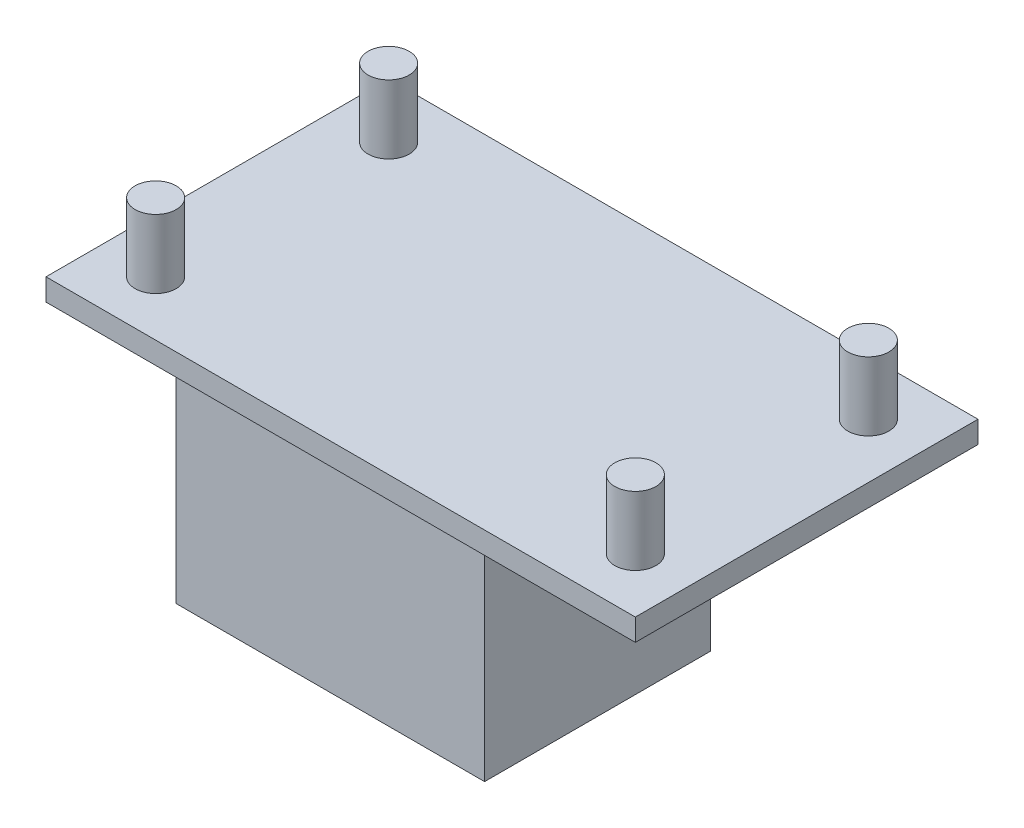
ISO-10303-21;
HEADER;
FILE_DESCRIPTION(('STEP AP214'),'2;1');
FILE_NAME('part.step','',(''),(''),'','','');
FILE_SCHEMA(('AUTOMOTIVE_DESIGN { 1 0 10303 214 1 1 1 1 }'));
ENDSEC;
DATA;
#1=APPLICATION_CONTEXT('core data for automotive mechanical design processes');
#2=APPLICATION_PROTOCOL_DEFINITION('international standard','automotive_design',2000,#1);
#3=PRODUCT_CONTEXT('',#1,'mechanical');
#4=PRODUCT('Part','Part','',(#3));
#5=PRODUCT_RELATED_PRODUCT_CATEGORY('part','',(#4));
#6=PRODUCT_DEFINITION_FORMATION('','',#4);
#7=PRODUCT_DEFINITION_CONTEXT('part definition',#1,'design');
#8=PRODUCT_DEFINITION('design','',#6,#7);
#9=PRODUCT_DEFINITION_SHAPE('','',#8);
#10=(LENGTH_UNIT() NAMED_UNIT(*) SI_UNIT(.MILLI.,.METRE.));
#11=(NAMED_UNIT(*) PLANE_ANGLE_UNIT() SI_UNIT($,.RADIAN.));
#12=(NAMED_UNIT(*) SI_UNIT($,.STERADIAN.) SOLID_ANGLE_UNIT());
#13=UNCERTAINTY_MEASURE_WITH_UNIT(LENGTH_MEASURE(1.E-05),#10,'distance_accuracy_value','');
#14=(GEOMETRIC_REPRESENTATION_CONTEXT(3) GLOBAL_UNCERTAINTY_ASSIGNED_CONTEXT((#13)) GLOBAL_UNIT_ASSIGNED_CONTEXT((#10,
#11,#12)) REPRESENTATION_CONTEXT('',''));
#15=CARTESIAN_POINT('',(0.,0.,0.));
#16=DIRECTION('',(0.,0.,1.));
#17=DIRECTION('',(1.,0.,0.));
#18=AXIS2_PLACEMENT_3D('',#15,#16,#17);
#19=CARTESIAN_POINT('',(-17.5,25.4,-8.5));
#20=DIRECTION('',(0.,-1.,0.));
#21=DIRECTION('',(0.,0.,-1.));
#22=AXIS2_PLACEMENT_3D('',#19,#20,#21);
#23=CYLINDRICAL_SURFACE('',#22,1.5);
#24=CARTESIAN_POINT('',(-17.5,25.4,-8.5));
#25=DIRECTION('',(0.,1.,0.));
#26=DIRECTION('',(0.,0.,1.));
#27=AXIS2_PLACEMENT_3D('',#24,#25,#26);
#28=CIRCLE('',#27,1.5);
#29=CARTESIAN_POINT('',(-17.5,25.4,-7.));
#30=VERTEX_POINT('',#29);
#31=EDGE_CURVE('E11',#30,#30,#28,.T.);
#32=ORIENTED_EDGE('',*,*,#31,.F.);
#33=EDGE_LOOP('',(#32));
#34=FACE_BOUND('',#33,.T.);
#35=CARTESIAN_POINT('',(-17.5,20.4,-8.5));
#36=DIRECTION('',(0.,1.,0.));
#37=DIRECTION('',(0.,0.,1.));
#38=AXIS2_PLACEMENT_3D('',#35,#36,#37);
#39=CIRCLE('',#38,1.5);
#40=CARTESIAN_POINT('',(-17.5,20.4,-7.));
#41=VERTEX_POINT('',#40);
#42=EDGE_CURVE('E46',#41,#41,#39,.T.);
#43=ORIENTED_EDGE('',*,*,#42,.T.);
#44=EDGE_LOOP('',(#43));
#45=FACE_BOUND('',#44,.T.);
#46=ADVANCED_FACE('F43',(#34,#45),#23,.T.);
#47=CARTESIAN_POINT('',(-17.5,25.4,-8.5));
#48=DIRECTION('',(0.,1.,0.));
#49=DIRECTION('',(0.,0.,1.));
#50=AXIS2_PLACEMENT_3D('',#47,#48,#49);
#51=PLANE('',#50);
#52=ORIENTED_EDGE('',*,*,#31,.T.);
#53=EDGE_LOOP('',(#52));
#54=FACE_BOUND('',#53,.T.);
#55=ADVANCED_FACE('F221',(#54),#51,.T.);
#56=CARTESIAN_POINT('',(-21.5,20.4,-12.5));
#57=DIRECTION('',(1.,0.,0.));
#58=DIRECTION('',(0.,0.,-1.));
#59=AXIS2_PLACEMENT_3D('',#56,#57,#58);
#60=PLANE('',#59);
#61=DIRECTION('',(0.,0.,1.));
#62=VECTOR('',#61,1.);
#63=CARTESIAN_POINT('',(-21.5,18.8,-12.5));
#64=LINE('',#63,#62);
#65=CARTESIAN_POINT('',(-21.5,18.8,-12.5));
#66=VERTEX_POINT('',#65);
#67=CARTESIAN_POINT('',(-21.5,18.8,12.5));
#68=VERTEX_POINT('',#67);
#69=EDGE_CURVE('E175',#66,#68,#64,.T.);
#70=ORIENTED_EDGE('',*,*,#69,.T.);
#71=DIRECTION('',(0.,-1.,0.));
#72=VECTOR('',#71,1.);
#73=CARTESIAN_POINT('',(-21.5,20.4,12.5));
#74=LINE('',#73,#72);
#75=CARTESIAN_POINT('',(-21.5,20.4,12.5));
#76=VERTEX_POINT('',#75);
#77=EDGE_CURVE('E193',#76,#68,#74,.T.);
#78=ORIENTED_EDGE('',*,*,#77,.F.);
#79=DIRECTION('',(0.,0.,1.));
#80=VECTOR('',#79,1.);
#81=CARTESIAN_POINT('',(-21.5,20.4,-12.5));
#82=LINE('',#81,#80);
#83=CARTESIAN_POINT('',(-21.5,20.4,-12.5));
#84=VERTEX_POINT('',#83);
#85=EDGE_CURVE('E174',#84,#76,#82,.T.);
#86=ORIENTED_EDGE('',*,*,#85,.F.);
#87=DIRECTION('',(0.,-1.,0.));
#88=VECTOR('',#87,1.);
#89=CARTESIAN_POINT('',(-21.5,20.4,-12.5));
#90=LINE('',#89,#88);
#91=EDGE_CURVE('E182',#84,#66,#90,.T.);
#92=ORIENTED_EDGE('',*,*,#91,.T.);
#93=EDGE_LOOP('',(#70,#78,#86,#92));
#94=FACE_BOUND('',#93,.T.);
#95=ADVANCED_FACE('F208',(#94),#60,.F.);
#96=CARTESIAN_POINT('',(-21.5,20.4,12.5));
#97=DIRECTION('',(0.,0.,-1.));
#98=DIRECTION('',(-1.,0.,0.));
#99=AXIS2_PLACEMENT_3D('',#96,#97,#98);
#100=PLANE('',#99);
#101=DIRECTION('',(1.,0.,0.));
#102=VECTOR('',#101,1.);
#103=CARTESIAN_POINT('',(-21.5,18.8,12.5));
#104=LINE('',#103,#102);
#105=CARTESIAN_POINT('',(21.5,18.8,12.5));
#106=VERTEX_POINT('',#105);
#107=EDGE_CURVE('E184',#68,#106,#104,.T.);
#108=ORIENTED_EDGE('',*,*,#107,.T.);
#109=DIRECTION('',(0.,-1.,0.));
#110=VECTOR('',#109,1.);
#111=CARTESIAN_POINT('',(21.5,20.4,12.5));
#112=LINE('',#111,#110);
#113=CARTESIAN_POINT('',(21.5,20.4,12.5));
#114=VERTEX_POINT('',#113);
#115=EDGE_CURVE('E195',#114,#106,#112,.T.);
#116=ORIENTED_EDGE('',*,*,#115,.F.);
#117=DIRECTION('',(1.,0.,0.));
#118=VECTOR('',#117,1.);
#119=CARTESIAN_POINT('',(-21.5,20.4,12.5));
#120=LINE('',#119,#118);
#121=EDGE_CURVE('E92',#76,#114,#120,.T.);
#122=ORIENTED_EDGE('',*,*,#121,.F.);
#123=ORIENTED_EDGE('',*,*,#77,.T.);
#124=EDGE_LOOP('',(#108,#116,#122,#123));
#125=FACE_BOUND('',#124,.T.);
#126=ADVANCED_FACE('F211',(#125),#100,.F.);
#127=CARTESIAN_POINT('',(21.5,20.4,12.5));
#128=DIRECTION('',(-1.,0.,0.));
#129=DIRECTION('',(0.,0.,1.));
#130=AXIS2_PLACEMENT_3D('',#127,#128,#129);
#131=PLANE('',#130);
#132=DIRECTION('',(0.,0.,-1.));
#133=VECTOR('',#132,1.);
#134=CARTESIAN_POINT('',(21.5,18.8,12.5));
#135=LINE('',#134,#133);
#136=CARTESIAN_POINT('',(21.5,18.8,-12.5));
#137=VERTEX_POINT('',#136);
#138=EDGE_CURVE('E186',#106,#137,#135,.T.);
#139=ORIENTED_EDGE('',*,*,#138,.T.);
#140=DIRECTION('',(0.,-1.,0.));
#141=VECTOR('',#140,1.);
#142=CARTESIAN_POINT('',(21.5,20.4,-12.5));
#143=LINE('',#142,#141);
#144=CARTESIAN_POINT('',(21.5,20.4,-12.5));
#145=VERTEX_POINT('',#144);
#146=EDGE_CURVE('E189',#145,#137,#143,.T.);
#147=ORIENTED_EDGE('',*,*,#146,.F.);
#148=DIRECTION('',(0.,0.,-1.));
#149=VECTOR('',#148,1.);
#150=CARTESIAN_POINT('',(21.5,20.4,12.5));
#151=LINE('',#150,#149);
#152=EDGE_CURVE('E179',#114,#145,#151,.T.);
#153=ORIENTED_EDGE('',*,*,#152,.F.);
#154=ORIENTED_EDGE('',*,*,#115,.T.);
#155=EDGE_LOOP('',(#139,#147,#153,#154));
#156=FACE_BOUND('',#155,.T.);
#157=ADVANCED_FACE('F212',(#156),#131,.F.);
#158=CARTESIAN_POINT('',(21.5,20.4,-12.5));
#159=DIRECTION('',(0.,0.,1.));
#160=DIRECTION('',(1.,0.,0.));
#161=AXIS2_PLACEMENT_3D('',#158,#159,#160);
#162=PLANE('',#161);
#163=DIRECTION('',(-1.,0.,0.));
#164=VECTOR('',#163,1.);
#165=CARTESIAN_POINT('',(21.5,18.8,-12.5));
#166=LINE('',#165,#164);
#167=EDGE_CURVE('E87',#137,#66,#166,.T.);
#168=ORIENTED_EDGE('',*,*,#167,.T.);
#169=ORIENTED_EDGE('',*,*,#91,.F.);
#170=DIRECTION('',(-1.,0.,0.));
#171=VECTOR('',#170,1.);
#172=CARTESIAN_POINT('',(21.5,20.4,-12.5));
#173=LINE('',#172,#171);
#174=EDGE_CURVE('E67',#145,#84,#173,.T.);
#175=ORIENTED_EDGE('',*,*,#174,.F.);
#176=ORIENTED_EDGE('',*,*,#146,.T.);
#177=EDGE_LOOP('',(#168,#169,#175,#176));
#178=FACE_BOUND('',#177,.T.);
#179=ADVANCED_FACE('F201',(#178),#162,.F.);
#180=CARTESIAN_POINT('',(0.,20.4,0.));
#181=DIRECTION('',(0.,1.,0.));
#182=DIRECTION('',(0.,0.,1.));
#183=AXIS2_PLACEMENT_3D('',#180,#181,#182);
#184=PLANE('',#183);
#185=CARTESIAN_POINT('',(17.5,20.4,8.5));
#186=DIRECTION('',(0.,1.,0.));
#187=DIRECTION('',(0.,0.,1.));
#188=AXIS2_PLACEMENT_3D('',#185,#186,#187);
#189=CIRCLE('',#188,1.5);
#190=CARTESIAN_POINT('',(17.5,20.4,10.));
#191=VERTEX_POINT('',#190);
#192=EDGE_CURVE('E132',#191,#191,#189,.T.);
#193=ORIENTED_EDGE('',*,*,#192,.F.);
#194=EDGE_LOOP('',(#193));
#195=FACE_BOUND('',#194,.T.);
#196=CARTESIAN_POINT('',(17.5,20.4,-8.5));
#197=DIRECTION('',(0.,1.,0.));
#198=DIRECTION('',(0.,0.,1.));
#199=AXIS2_PLACEMENT_3D('',#196,#197,#198);
#200=CIRCLE('',#199,1.5);
#201=CARTESIAN_POINT('',(17.5,20.4,-7.));
#202=VERTEX_POINT('',#201);
#203=EDGE_CURVE('E159',#202,#202,#200,.T.);
#204=ORIENTED_EDGE('',*,*,#203,.F.);
#205=EDGE_LOOP('',(#204));
#206=FACE_BOUND('',#205,.T.);
#207=CARTESIAN_POINT('',(-17.5,20.4,8.5));
#208=DIRECTION('',(0.,1.,0.));
#209=DIRECTION('',(0.,0.,1.));
#210=AXIS2_PLACEMENT_3D('',#207,#208,#209);
#211=CIRCLE('',#210,1.5);
#212=CARTESIAN_POINT('',(-17.5,20.4,10.));
#213=VERTEX_POINT('',#212);
#214=EDGE_CURVE('E167',#213,#213,#211,.T.);
#215=ORIENTED_EDGE('',*,*,#214,.F.);
#216=EDGE_LOOP('',(#215));
#217=FACE_BOUND('',#216,.T.);
#218=ORIENTED_EDGE('',*,*,#42,.F.);
#219=EDGE_LOOP('',(#218));
#220=FACE_BOUND('',#219,.T.);
#221=ORIENTED_EDGE('',*,*,#85,.T.);
#222=ORIENTED_EDGE('',*,*,#121,.T.);
#223=ORIENTED_EDGE('',*,*,#152,.T.);
#224=ORIENTED_EDGE('',*,*,#174,.T.);
#225=EDGE_LOOP('',(#221,#222,#223,#224));
#226=FACE_BOUND('',#225,.T.);
#227=ADVANCED_FACE('F203',(#195,#206,#217,#220,#226),#184,.T.);
#228=CARTESIAN_POINT('',(0.,18.8,0.));
#229=DIRECTION('',(0.,1.,0.));
#230=DIRECTION('',(0.,0.,1.));
#231=AXIS2_PLACEMENT_3D('',#228,#229,#230);
#232=PLANE('',#231);
#233=DIRECTION('',(-1.,0.,0.));
#234=VECTOR('',#233,1.);
#235=CARTESIAN_POINT('',(6.,18.8,-8.5));
#236=LINE('',#235,#234);
#237=CARTESIAN_POINT('',(6.,18.8,-8.5));
#238=VERTEX_POINT('',#237);
#239=CARTESIAN_POINT('',(-16.5,18.8,-8.5));
#240=VERTEX_POINT('',#239);
#241=EDGE_CURVE('E136',#238,#240,#236,.T.);
#242=ORIENTED_EDGE('',*,*,#241,.T.);
#243=DIRECTION('',(0.,0.,1.));
#244=VECTOR('',#243,1.);
#245=CARTESIAN_POINT('',(-16.5,18.8,-8.5));
#246=LINE('',#245,#244);
#247=CARTESIAN_POINT('',(-16.5,18.8,8.));
#248=VERTEX_POINT('',#247);
#249=EDGE_CURVE('E60',#240,#248,#246,.T.);
#250=ORIENTED_EDGE('',*,*,#249,.T.);
#251=DIRECTION('',(1.,0.,0.));
#252=VECTOR('',#251,1.);
#253=CARTESIAN_POINT('',(-16.5,18.8,8.));
#254=LINE('',#253,#252);
#255=CARTESIAN_POINT('',(6.,18.8,8.));
#256=VERTEX_POINT('',#255);
#257=EDGE_CURVE('E118',#248,#256,#254,.T.);
#258=ORIENTED_EDGE('',*,*,#257,.T.);
#259=DIRECTION('',(0.,0.,-1.));
#260=VECTOR('',#259,1.);
#261=CARTESIAN_POINT('',(6.,18.8,8.));
#262=LINE('',#261,#260);
#263=EDGE_CURVE('E126',#256,#238,#262,.T.);
#264=ORIENTED_EDGE('',*,*,#263,.T.);
#265=EDGE_LOOP('',(#242,#250,#258,#264));
#266=FACE_BOUND('',#265,.T.);
#267=ORIENTED_EDGE('',*,*,#69,.F.);
#268=ORIENTED_EDGE('',*,*,#167,.F.);
#269=ORIENTED_EDGE('',*,*,#138,.F.);
#270=ORIENTED_EDGE('',*,*,#107,.F.);
#271=EDGE_LOOP('',(#267,#268,#269,#270));
#272=FACE_BOUND('',#271,.T.);
#273=ADVANCED_FACE('F137',(#266,#272),#232,.F.);
#274=CARTESIAN_POINT('',(-17.5,25.4,8.5));
#275=DIRECTION('',(0.,-1.,0.));
#276=DIRECTION('',(0.,0.,-1.));
#277=AXIS2_PLACEMENT_3D('',#274,#275,#276);
#278=CYLINDRICAL_SURFACE('',#277,1.5);
#279=CARTESIAN_POINT('',(-17.5,25.4,8.5));
#280=DIRECTION('',(0.,1.,0.));
#281=DIRECTION('',(0.,0.,1.));
#282=AXIS2_PLACEMENT_3D('',#279,#280,#281);
#283=CIRCLE('',#282,1.5);
#284=CARTESIAN_POINT('',(-17.5,25.4,10.));
#285=VERTEX_POINT('',#284);
#286=EDGE_CURVE('E166',#285,#285,#283,.T.);
#287=ORIENTED_EDGE('',*,*,#286,.F.);
#288=EDGE_LOOP('',(#287));
#289=FACE_BOUND('',#288,.T.);
#290=ORIENTED_EDGE('',*,*,#214,.T.);
#291=EDGE_LOOP('',(#290));
#292=FACE_BOUND('',#291,.T.);
#293=ADVANCED_FACE('F264',(#289,#292),#278,.T.);
#294=CARTESIAN_POINT('',(-17.5,25.4,8.5));
#295=DIRECTION('',(0.,1.,0.));
#296=DIRECTION('',(0.,0.,1.));
#297=AXIS2_PLACEMENT_3D('',#294,#295,#296);
#298=PLANE('',#297);
#299=ORIENTED_EDGE('',*,*,#286,.T.);
#300=EDGE_LOOP('',(#299));
#301=FACE_BOUND('',#300,.T.);
#302=ADVANCED_FACE('F273',(#301),#298,.T.);
#303=CARTESIAN_POINT('',(17.5,25.4,-8.5));
#304=DIRECTION('',(0.,-1.,0.));
#305=DIRECTION('',(0.,0.,-1.));
#306=AXIS2_PLACEMENT_3D('',#303,#304,#305);
#307=CYLINDRICAL_SURFACE('',#306,1.5);
#308=CARTESIAN_POINT('',(17.5,25.4,-8.5));
#309=DIRECTION('',(0.,1.,0.));
#310=DIRECTION('',(0.,0.,1.));
#311=AXIS2_PLACEMENT_3D('',#308,#309,#310);
#312=CIRCLE('',#311,1.5);
#313=CARTESIAN_POINT('',(17.5,25.4,-7.));
#314=VERTEX_POINT('',#313);
#315=EDGE_CURVE('E162',#314,#314,#312,.T.);
#316=ORIENTED_EDGE('',*,*,#315,.F.);
#317=EDGE_LOOP('',(#316));
#318=FACE_BOUND('',#317,.T.);
#319=ORIENTED_EDGE('',*,*,#203,.T.);
#320=EDGE_LOOP('',(#319));
#321=FACE_BOUND('',#320,.T.);
#322=ADVANCED_FACE('F283',(#318,#321),#307,.T.);
#323=CARTESIAN_POINT('',(17.5,25.4,-8.5));
#324=DIRECTION('',(0.,1.,0.));
#325=DIRECTION('',(0.,0.,1.));
#326=AXIS2_PLACEMENT_3D('',#323,#324,#325);
#327=PLANE('',#326);
#328=ORIENTED_EDGE('',*,*,#315,.T.);
#329=EDGE_LOOP('',(#328));
#330=FACE_BOUND('',#329,.T.);
#331=ADVANCED_FACE('F294',(#330),#327,.T.);
#332=CARTESIAN_POINT('',(17.5,25.4,8.5));
#333=DIRECTION('',(0.,-1.,0.));
#334=DIRECTION('',(0.,0.,-1.));
#335=AXIS2_PLACEMENT_3D('',#332,#333,#334);
#336=CYLINDRICAL_SURFACE('',#335,1.5);
#337=CARTESIAN_POINT('',(17.5,25.4,8.5));
#338=DIRECTION('',(0.,1.,0.));
#339=DIRECTION('',(0.,0.,1.));
#340=AXIS2_PLACEMENT_3D('',#337,#338,#339);
#341=CIRCLE('',#340,1.5);
#342=CARTESIAN_POINT('',(17.5,25.4,10.));
#343=VERTEX_POINT('',#342);
#344=EDGE_CURVE('E160',#343,#343,#341,.T.);
#345=ORIENTED_EDGE('',*,*,#344,.F.);
#346=EDGE_LOOP('',(#345));
#347=FACE_BOUND('',#346,.T.);
#348=ORIENTED_EDGE('',*,*,#192,.T.);
#349=EDGE_LOOP('',(#348));
#350=FACE_BOUND('',#349,.T.);
#351=ADVANCED_FACE('F301',(#347,#350),#336,.T.);
#352=CARTESIAN_POINT('',(17.5,25.4,8.5));
#353=DIRECTION('',(0.,1.,0.));
#354=DIRECTION('',(0.,0.,1.));
#355=AXIS2_PLACEMENT_3D('',#352,#353,#354);
#356=PLANE('',#355);
#357=ORIENTED_EDGE('',*,*,#344,.T.);
#358=EDGE_LOOP('',(#357));
#359=FACE_BOUND('',#358,.T.);
#360=ADVANCED_FACE('F314',(#359),#356,.T.);
#361=CARTESIAN_POINT('',(-16.5,18.8,-8.5));
#362=DIRECTION('',(1.,0.,0.));
#363=DIRECTION('',(0.,0.,-1.));
#364=AXIS2_PLACEMENT_3D('',#361,#362,#363);
#365=PLANE('',#364);
#366=DIRECTION('',(0.,0.,1.));
#367=VECTOR('',#366,1.);
#368=CARTESIAN_POINT('',(-16.5,0.,-8.5));
#369=LINE('',#368,#367);
#370=CARTESIAN_POINT('',(-16.5,0.,-8.5));
#371=VERTEX_POINT('',#370);
#372=CARTESIAN_POINT('',(-16.5,0.,8.));
#373=VERTEX_POINT('',#372);
#374=EDGE_CURVE('E135',#371,#373,#369,.T.);
#375=ORIENTED_EDGE('',*,*,#374,.T.);
#376=DIRECTION('',(0.,-1.,0.));
#377=VECTOR('',#376,1.);
#378=CARTESIAN_POINT('',(-16.5,18.8,8.));
#379=LINE('',#378,#377);
#380=EDGE_CURVE('E122',#248,#373,#379,.T.);
#381=ORIENTED_EDGE('',*,*,#380,.F.);
#382=ORIENTED_EDGE('',*,*,#249,.F.);
#383=DIRECTION('',(0.,-1.,0.));
#384=VECTOR('',#383,1.);
#385=CARTESIAN_POINT('',(-16.5,18.8,-8.5));
#386=LINE('',#385,#384);
#387=EDGE_CURVE('E150',#240,#371,#386,.T.);
#388=ORIENTED_EDGE('',*,*,#387,.T.);
#389=EDGE_LOOP('',(#375,#381,#382,#388));
#390=FACE_BOUND('',#389,.T.);
#391=ADVANCED_FACE('F128',(#390),#365,.F.);
#392=CARTESIAN_POINT('',(-16.5,18.8,8.));
#393=DIRECTION('',(0.,0.,-1.));
#394=DIRECTION('',(-1.,0.,0.));
#395=AXIS2_PLACEMENT_3D('',#392,#393,#394);
#396=PLANE('',#395);
#397=DIRECTION('',(1.,0.,0.));
#398=VECTOR('',#397,1.);
#399=CARTESIAN_POINT('',(-16.5,0.,8.));
#400=LINE('',#399,#398);
#401=CARTESIAN_POINT('',(6.,0.,8.));
#402=VERTEX_POINT('',#401);
#403=EDGE_CURVE('E149',#373,#402,#400,.T.);
#404=ORIENTED_EDGE('',*,*,#403,.T.);
#405=DIRECTION('',(0.,-1.,0.));
#406=VECTOR('',#405,1.);
#407=CARTESIAN_POINT('',(6.,18.8,8.));
#408=LINE('',#407,#406);
#409=EDGE_CURVE('E121',#256,#402,#408,.T.);
#410=ORIENTED_EDGE('',*,*,#409,.F.);
#411=ORIENTED_EDGE('',*,*,#257,.F.);
#412=ORIENTED_EDGE('',*,*,#380,.T.);
#413=EDGE_LOOP('',(#404,#410,#411,#412));
#414=FACE_BOUND('',#413,.T.);
#415=ADVANCED_FACE('F119',(#414),#396,.F.);
#416=CARTESIAN_POINT('',(6.,18.8,8.));
#417=DIRECTION('',(-1.,0.,0.));
#418=DIRECTION('',(0.,0.,1.));
#419=AXIS2_PLACEMENT_3D('',#416,#417,#418);
#420=PLANE('',#419);
#421=DIRECTION('',(0.,0.,-1.));
#422=VECTOR('',#421,1.);
#423=CARTESIAN_POINT('',(6.,0.,8.));
#424=LINE('',#423,#422);
#425=CARTESIAN_POINT('',(6.,0.,-8.5));
#426=VERTEX_POINT('',#425);
#427=EDGE_CURVE('E142',#402,#426,#424,.T.);
#428=ORIENTED_EDGE('',*,*,#427,.T.);
#429=DIRECTION('',(0.,-1.,0.));
#430=VECTOR('',#429,1.);
#431=CARTESIAN_POINT('',(6.,18.8,-8.5));
#432=LINE('',#431,#430);
#433=EDGE_CURVE('E153',#238,#426,#432,.T.);
#434=ORIENTED_EDGE('',*,*,#433,.F.);
#435=ORIENTED_EDGE('',*,*,#263,.F.);
#436=ORIENTED_EDGE('',*,*,#409,.T.);
#437=EDGE_LOOP('',(#428,#434,#435,#436));
#438=FACE_BOUND('',#437,.T.);
#439=ADVANCED_FACE('F338',(#438),#420,.F.);
#440=CARTESIAN_POINT('',(6.,18.8,-8.5));
#441=DIRECTION('',(0.,0.,1.));
#442=DIRECTION('',(1.,0.,0.));
#443=AXIS2_PLACEMENT_3D('',#440,#441,#442);
#444=PLANE('',#443);
#445=DIRECTION('',(-1.,0.,0.));
#446=VECTOR('',#445,1.);
#447=CARTESIAN_POINT('',(6.,0.,-8.5));
#448=LINE('',#447,#446);
#449=EDGE_CURVE('E138',#426,#371,#448,.T.);
#450=ORIENTED_EDGE('',*,*,#449,.T.);
#451=ORIENTED_EDGE('',*,*,#387,.F.);
#452=ORIENTED_EDGE('',*,*,#241,.F.);
#453=ORIENTED_EDGE('',*,*,#433,.T.);
#454=EDGE_LOOP('',(#450,#451,#452,#453));
#455=FACE_BOUND('',#454,.T.);
#456=ADVANCED_FACE('F346',(#455),#444,.F.);
#457=CARTESIAN_POINT('',(0.,0.,0.));
#458=DIRECTION('',(0.,1.,0.));
#459=DIRECTION('',(0.,0.,1.));
#460=AXIS2_PLACEMENT_3D('',#457,#458,#459);
#461=PLANE('',#460);
#462=ORIENTED_EDGE('',*,*,#374,.F.);
#463=ORIENTED_EDGE('',*,*,#449,.F.);
#464=ORIENTED_EDGE('',*,*,#427,.F.);
#465=ORIENTED_EDGE('',*,*,#403,.F.);
#466=EDGE_LOOP('',(#462,#463,#464,#465));
#467=FACE_BOUND('',#466,.T.);
#468=ADVANCED_FACE('F359',(#467),#461,.F.);
#469=CLOSED_SHELL('',(#46,#55,#95,#126,#157,#179,#227,#273,#293,#302,#322,#331,#351,#360,#391,
#415,#439,#456,#468));
#470=MANIFOLD_SOLID_BREP('B2',#469);
#471=ADVANCED_BREP_SHAPE_REPRESENTATION('',(#18,#470),#14);
#472=SHAPE_DEFINITION_REPRESENTATION(#9,#471);
ENDSEC;
END-ISO-10303-21;
